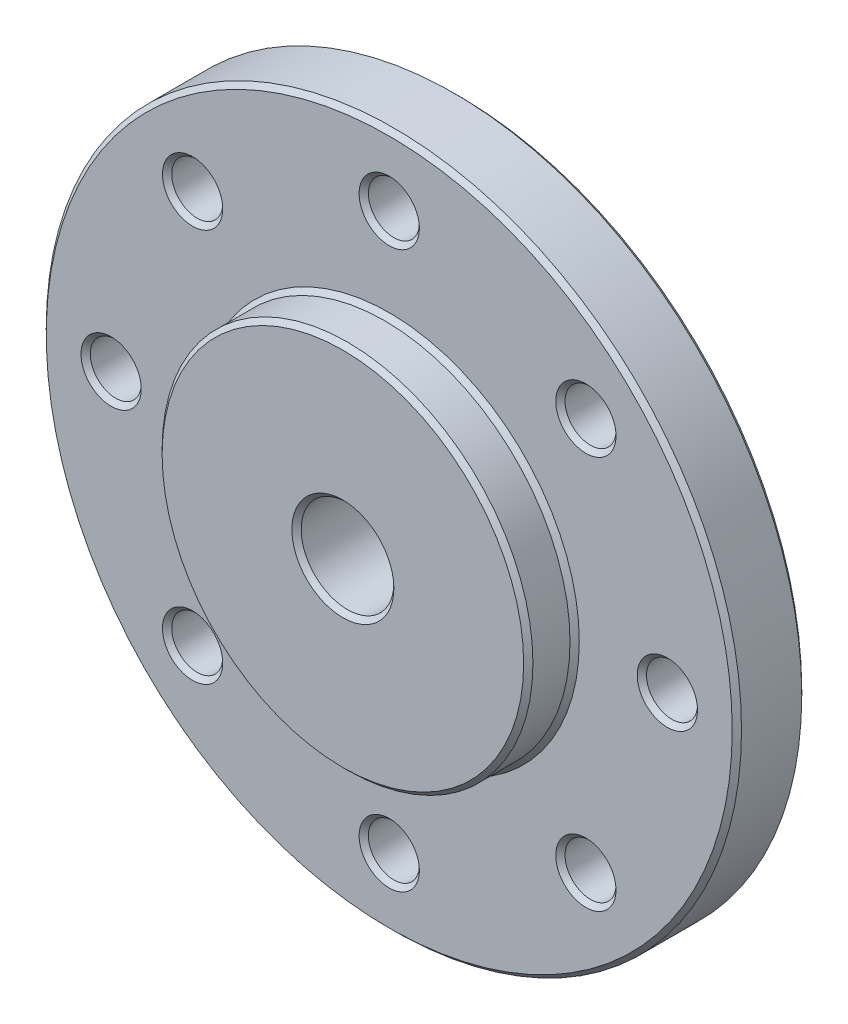
ISO-10303-21;
HEADER;
FILE_DESCRIPTION(('STEP AP214'),'2;1');
FILE_NAME('part.step','',(''),(''),'','','');
FILE_SCHEMA(('AUTOMOTIVE_DESIGN { 1 0 10303 214 1 1 1 1 }'));
ENDSEC;
DATA;
#1=APPLICATION_CONTEXT('core data for automotive mechanical design processes');
#2=APPLICATION_PROTOCOL_DEFINITION('international standard','automotive_design',2000,#1);
#3=PRODUCT_CONTEXT('',#1,'mechanical');
#4=PRODUCT('Part','Part','',(#3));
#5=PRODUCT_RELATED_PRODUCT_CATEGORY('part','',(#4));
#6=PRODUCT_DEFINITION_FORMATION('','',#4);
#7=PRODUCT_DEFINITION_CONTEXT('part definition',#1,'design');
#8=PRODUCT_DEFINITION('design','',#6,#7);
#9=PRODUCT_DEFINITION_SHAPE('','',#8);
#10=(LENGTH_UNIT() NAMED_UNIT(*) SI_UNIT(.MILLI.,.METRE.));
#11=(NAMED_UNIT(*) PLANE_ANGLE_UNIT() SI_UNIT($,.RADIAN.));
#12=(NAMED_UNIT(*) SI_UNIT($,.STERADIAN.) SOLID_ANGLE_UNIT());
#13=UNCERTAINTY_MEASURE_WITH_UNIT(LENGTH_MEASURE(1.E-05),#10,'distance_accuracy_value','');
#14=(GEOMETRIC_REPRESENTATION_CONTEXT(3) GLOBAL_UNCERTAINTY_ASSIGNED_CONTEXT((#13)) GLOBAL_UNIT_ASSIGNED_CONTEXT((#10,
#11,#12)) REPRESENTATION_CONTEXT('',''));
#15=CARTESIAN_POINT('',(0.,0.,0.));
#16=DIRECTION('',(0.,0.,1.));
#17=DIRECTION('',(1.,0.,0.));
#18=AXIS2_PLACEMENT_3D('',#15,#16,#17);
#19=CARTESIAN_POINT('',(0.,0.,15.));
#20=DIRECTION('',(0.,0.,1.));
#21=DIRECTION('',(1.,0.,0.));
#22=AXIS2_PLACEMENT_3D('',#19,#20,#21);
#23=CYLINDRICAL_SURFACE('',#22,40.);
#24=DIRECTION('',(0.,0.,1.));
#25=VECTOR('',#24,1.);
#26=CARTESIAN_POINT('',(40.,0.,15.));
#27=LINE('',#26,#25);
#28=CARTESIAN_POINT('',(40.,0.,16.));
#29=VERTEX_POINT('',#28);
#30=CARTESIAN_POINT('',(40.,0.,24.));
#31=VERTEX_POINT('',#30);
#32=EDGE_CURVE('E9',#29,#31,#27,.T.);
#33=ORIENTED_EDGE('',*,*,#32,.F.);
#34=CARTESIAN_POINT('',(0.,0.,16.));
#35=DIRECTION('',(0.,0.,1.));
#36=DIRECTION('',(1.,0.,0.));
#37=AXIS2_PLACEMENT_3D('',#34,#35,#36);
#38=CIRCLE('',#37,40.);
#39=EDGE_CURVE('E366',#29,#29,#38,.T.);
#40=ORIENTED_EDGE('',*,*,#39,.T.);
#41=ORIENTED_EDGE('',*,*,#32,.T.);
#42=CARTESIAN_POINT('',(0.,0.,24.));
#43=DIRECTION('',(0.,0.,1.));
#44=DIRECTION('',(1.,0.,0.));
#45=AXIS2_PLACEMENT_3D('',#42,#43,#44);
#46=CIRCLE('',#45,40.);
#47=EDGE_CURVE('E442',#31,#31,#46,.T.);
#48=ORIENTED_EDGE('',*,*,#47,.F.);
#49=EDGE_LOOP('',(#33,#40,#41,#48));
#50=FACE_BOUND('',#49,.T.);
#51=ADVANCED_FACE('F15',(#50),#23,.T.);
#52=CARTESIAN_POINT('',(0.,0.,24.));
#53=DIRECTION('',(0.,0.,-1.));
#54=DIRECTION('',(1.,0.,0.));
#55=AXIS2_PLACEMENT_3D('',#52,#53,#54);
#56=CONICAL_SURFACE('',#55,40.,0.785398163397);
#57=ORIENTED_EDGE('',*,*,#47,.T.);
#58=DIRECTION('',(0.707106781186548,0.,-0.707106781186548));
#59=VECTOR('',#58,1.);
#60=CARTESIAN_POINT('',(40.,0.,24.));
#61=LINE('',#60,#59);
#62=CARTESIAN_POINT('',(39.,0.,25.));
#63=VERTEX_POINT('',#62);
#64=EDGE_CURVE('E23',#63,#31,#61,.T.);
#65=ORIENTED_EDGE('',*,*,#64,.F.);
#66=CARTESIAN_POINT('',(0.,0.,25.));
#67=DIRECTION('',(0.,0.,1.));
#68=DIRECTION('',(1.,0.,0.));
#69=AXIS2_PLACEMENT_3D('',#66,#67,#68);
#70=CIRCLE('',#69,39.);
#71=EDGE_CURVE('E367',#63,#63,#70,.T.);
#72=ORIENTED_EDGE('',*,*,#71,.F.);
#73=ORIENTED_EDGE('',*,*,#64,.T.);
#74=EDGE_LOOP('',(#57,#65,#72,#73));
#75=FACE_BOUND('',#74,.T.);
#76=ADVANCED_FACE('F449',(#75),#56,.T.);
#77=CARTESIAN_POINT('',(0.,0.,16.));
#78=DIRECTION('',(0.,0.,-1.));
#79=DIRECTION('',(1.,0.,0.));
#80=AXIS2_PLACEMENT_3D('',#77,#78,#79);
#81=CONICAL_SURFACE('',#80,40.,0.785398163397);
#82=DIRECTION('',(-0.707106781186548,0.,0.707106781186548));
#83=VECTOR('',#82,1.);
#84=CARTESIAN_POINT('',(40.,0.,16.));
#85=LINE('',#84,#83);
#86=CARTESIAN_POINT('',(41.,0.,15.));
#87=VERTEX_POINT('',#86);
#88=EDGE_CURVE('E362',#87,#29,#85,.T.);
#89=ORIENTED_EDGE('',*,*,#88,.F.);
#90=CARTESIAN_POINT('',(0.,0.,15.));
#91=DIRECTION('',(0.,0.,1.));
#92=DIRECTION('',(1.,0.,0.));
#93=AXIS2_PLACEMENT_3D('',#90,#91,#92);
#94=CIRCLE('',#93,41.);
#95=EDGE_CURVE('E433',#87,#87,#94,.T.);
#96=ORIENTED_EDGE('',*,*,#95,.T.);
#97=ORIENTED_EDGE('',*,*,#88,.T.);
#98=ORIENTED_EDGE('',*,*,#39,.F.);
#99=EDGE_LOOP('',(#89,#96,#97,#98));
#100=FACE_BOUND('',#99,.T.);
#101=ADVANCED_FACE('F455',(#100),#81,.T.);
#102=CARTESIAN_POINT('',(0.,0.,25.));
#103=DIRECTION('',(0.,0.,1.));
#104=DIRECTION('',(1.,0.,0.));
#105=AXIS2_PLACEMENT_3D('',#102,#103,#104);
#106=PLANE('',#105);
#107=ORIENTED_EDGE('',*,*,#71,.T.);
#108=EDGE_LOOP('',(#107));
#109=FACE_BOUND('',#108,.T.);
#110=CARTESIAN_POINT('',(0.,0.,25.));
#111=DIRECTION('',(0.,0.,-1.));
#112=DIRECTION('',(1.,0.,0.));
#113=AXIS2_PLACEMENT_3D('',#110,#111,#112);
#114=CIRCLE('',#113,11.);
#115=CARTESIAN_POINT('',(11.,0.,25.));
#116=VERTEX_POINT('',#115);
#117=EDGE_CURVE('E423',#116,#116,#114,.T.);
#118=ORIENTED_EDGE('',*,*,#117,.T.);
#119=EDGE_LOOP('',(#118));
#120=FACE_BOUND('',#119,.T.);
#121=ADVANCED_FACE('F451',(#109,#120),#106,.T.);
#122=CARTESIAN_POINT('',(0.,0.,15.));
#123=DIRECTION('',(0.,0.,1.));
#124=DIRECTION('',(1.,0.,0.));
#125=AXIS2_PLACEMENT_3D('',#122,#123,#124);
#126=PLANE('',#125);
#127=ORIENTED_EDGE('',*,*,#95,.F.);
#128=EDGE_LOOP('',(#127));
#129=FACE_BOUND('',#128,.T.);
#130=CARTESIAN_POINT('',(-42.42640687119,42.426406871193,15.));
#131=DIRECTION('',(0.,0.,-1.));
#132=DIRECTION('',(-0.707106781186548,0.707106781186548,0.));
#133=AXIS2_PLACEMENT_3D('',#130,#131,#132);
#134=CIRCLE('',#133,6.5);
#135=CARTESIAN_POINT('',(-47.0226009489,47.022600948905,15.));
#136=VERTEX_POINT('',#135);
#137=EDGE_CURVE('E418',#136,#136,#134,.T.);
#138=ORIENTED_EDGE('',*,*,#137,.T.);
#139=EDGE_LOOP('',(#138));
#140=FACE_BOUND('',#139,.T.);
#141=CARTESIAN_POINT('',(0.,60.,15.));
#142=DIRECTION('',(0.,0.,-1.));
#143=DIRECTION('',(0.,1.,0.));
#144=AXIS2_PLACEMENT_3D('',#141,#142,#143);
#145=CIRCLE('',#144,6.5);
#146=CARTESIAN_POINT('',(0.,66.5,15.));
#147=VERTEX_POINT('',#146);
#148=EDGE_CURVE('E419',#147,#147,#145,.T.);
#149=ORIENTED_EDGE('',*,*,#148,.T.);
#150=EDGE_LOOP('',(#149));
#151=FACE_BOUND('',#150,.T.);
#152=CARTESIAN_POINT('',(-60.,0.,15.));
#153=DIRECTION('',(0.,0.,-1.));
#154=DIRECTION('',(-1.,0.,0.));
#155=AXIS2_PLACEMENT_3D('',#152,#153,#154);
#156=CIRCLE('',#155,6.5);
#157=CARTESIAN_POINT('',(-66.5,0.,15.));
#158=VERTEX_POINT('',#157);
#159=EDGE_CURVE('E375',#158,#158,#156,.T.);
#160=ORIENTED_EDGE('',*,*,#159,.T.);
#161=EDGE_LOOP('',(#160));
#162=FACE_BOUND('',#161,.T.);
#163=CARTESIAN_POINT('',(42.426406871193,42.426406871193,15.));
#164=DIRECTION('',(0.,0.,-1.));
#165=DIRECTION('',(0.707106781186548,0.707106781186548,0.));
#166=AXIS2_PLACEMENT_3D('',#163,#164,#165);
#167=CIRCLE('',#166,6.5);
#168=CARTESIAN_POINT('',(47.022600948905,47.022600948905,15.));
#169=VERTEX_POINT('',#168);
#170=EDGE_CURVE('E410',#169,#169,#167,.T.);
#171=ORIENTED_EDGE('',*,*,#170,.T.);
#172=EDGE_LOOP('',(#171));
#173=FACE_BOUND('',#172,.T.);
#174=CARTESIAN_POINT('',(60.,0.,15.));
#175=DIRECTION('',(0.,0.,-1.));
#176=DIRECTION('',(1.,0.,0.));
#177=AXIS2_PLACEMENT_3D('',#174,#175,#176);
#178=CIRCLE('',#177,6.5);
#179=CARTESIAN_POINT('',(66.5,0.,15.));
#180=VERTEX_POINT('',#179);
#181=EDGE_CURVE('E403',#180,#180,#178,.T.);
#182=ORIENTED_EDGE('',*,*,#181,.T.);
#183=EDGE_LOOP('',(#182));
#184=FACE_BOUND('',#183,.T.);
#185=CARTESIAN_POINT('',(-42.42640687119,-42.42640687119,15.));
#186=DIRECTION('',(0.,0.,-1.));
#187=DIRECTION('',(-0.707106781186548,-0.707106781186548,0.));
#188=AXIS2_PLACEMENT_3D('',#185,#186,#187);
#189=CIRCLE('',#188,6.5);
#190=CARTESIAN_POINT('',(-47.0226009489,-47.0226009489,15.));
#191=VERTEX_POINT('',#190);
#192=EDGE_CURVE('E399',#191,#191,#189,.T.);
#193=ORIENTED_EDGE('',*,*,#192,.T.);
#194=EDGE_LOOP('',(#193));
#195=FACE_BOUND('',#194,.T.);
#196=CARTESIAN_POINT('',(0.,-60.,15.));
#197=DIRECTION('',(0.,0.,-1.));
#198=DIRECTION('',(0.,-1.,0.));
#199=AXIS2_PLACEMENT_3D('',#196,#197,#198);
#200=CIRCLE('',#199,6.5);
#201=CARTESIAN_POINT('',(0.,-66.5,15.));
#202=VERTEX_POINT('',#201);
#203=EDGE_CURVE('E231',#202,#202,#200,.T.);
#204=ORIENTED_EDGE('',*,*,#203,.T.);
#205=EDGE_LOOP('',(#204));
#206=FACE_BOUND('',#205,.T.);
#207=CARTESIAN_POINT('',(42.426406871193,-42.42640687119,15.));
#208=DIRECTION('',(0.,0.,-1.));
#209=DIRECTION('',(0.707106781186548,-0.707106781186548,0.));
#210=AXIS2_PLACEMENT_3D('',#207,#208,#209);
#211=CIRCLE('',#210,6.5);
#212=CARTESIAN_POINT('',(47.022600948905,-47.0226009489,15.));
#213=VERTEX_POINT('',#212);
#214=EDGE_CURVE('E388',#213,#213,#211,.T.);
#215=ORIENTED_EDGE('',*,*,#214,.T.);
#216=EDGE_LOOP('',(#215));
#217=FACE_BOUND('',#216,.T.);
#218=CARTESIAN_POINT('',(0.,0.,15.));
#219=DIRECTION('',(0.,0.,1.));
#220=DIRECTION('',(1.,0.,0.));
#221=AXIS2_PLACEMENT_3D('',#218,#219,#220);
#222=CIRCLE('',#221,74.);
#223=CARTESIAN_POINT('',(74.,0.,15.));
#224=VERTEX_POINT('',#223);
#225=EDGE_CURVE('E383',#224,#224,#222,.T.);
#226=ORIENTED_EDGE('',*,*,#225,.T.);
#227=EDGE_LOOP('',(#226));
#228=FACE_BOUND('',#227,.T.);
#229=ADVANCED_FACE('F454',(#129,#140,#151,#162,#173,#184,#195,#206,#217,#228),#126,.T.);
#230=CARTESIAN_POINT('',(-42.42640687119,42.426406871193,14.));
#231=DIRECTION('',(0.,0.,1.));
#232=DIRECTION('',(-0.707106781186548,0.707106781186548,0.));
#233=AXIS2_PLACEMENT_3D('',#230,#231,#232);
#234=CONICAL_SURFACE('',#233,5.5,0.785398163397);
#235=DIRECTION('',(-0.49999999999984,0.49999999999984,0.707106781186774));
#236=VECTOR('',#235,1.);
#237=CARTESIAN_POINT('',(-46.31549416771,46.315494167719,14.));
#238=LINE('',#237,#236);
#239=CARTESIAN_POINT('',(-46.31549416771,46.315494167719,14.));
#240=VERTEX_POINT('',#239);
#241=EDGE_CURVE('E414',#240,#136,#238,.T.);
#242=ORIENTED_EDGE('',*,*,#241,.F.);
#243=CARTESIAN_POINT('',(-42.42640687119,42.426406871193,14.));
#244=DIRECTION('',(0.,0.,-1.));
#245=DIRECTION('',(-0.707106781186548,0.707106781186548,0.));
#246=AXIS2_PLACEMENT_3D('',#243,#244,#245);
#247=CIRCLE('',#246,5.5);
#248=EDGE_CURVE('E276',#240,#240,#247,.T.);
#249=ORIENTED_EDGE('',*,*,#248,.T.);
#250=ORIENTED_EDGE('',*,*,#241,.T.);
#251=ORIENTED_EDGE('',*,*,#137,.F.);
#252=EDGE_LOOP('',(#242,#249,#250,#251));
#253=FACE_BOUND('',#252,.T.);
#254=ADVANCED_FACE('F550',(#253),#234,.F.);
#255=CARTESIAN_POINT('',(0.,60.,14.));
#256=DIRECTION('',(0.,0.,1.));
#257=DIRECTION('',(0.,1.,0.));
#258=AXIS2_PLACEMENT_3D('',#255,#256,#257);
#259=CONICAL_SURFACE('',#258,5.5,0.785398163397);
#260=DIRECTION('',(0.,0.707106781186548,0.707106781186548));
#261=VECTOR('',#260,1.);
#262=CARTESIAN_POINT('',(0.,65.5,14.));
#263=LINE('',#262,#261);
#264=CARTESIAN_POINT('',(0.,65.5,14.));
#265=VERTEX_POINT('',#264);
#266=EDGE_CURVE('E378',#265,#147,#263,.T.);
#267=ORIENTED_EDGE('',*,*,#266,.F.);
#268=CARTESIAN_POINT('',(0.,60.,14.));
#269=DIRECTION('',(0.,0.,-1.));
#270=DIRECTION('',(0.,1.,0.));
#271=AXIS2_PLACEMENT_3D('',#268,#269,#270);
#272=CIRCLE('',#271,5.5);
#273=EDGE_CURVE('E258',#265,#265,#272,.T.);
#274=ORIENTED_EDGE('',*,*,#273,.T.);
#275=ORIENTED_EDGE('',*,*,#266,.T.);
#276=ORIENTED_EDGE('',*,*,#148,.F.);
#277=EDGE_LOOP('',(#267,#274,#275,#276));
#278=FACE_BOUND('',#277,.T.);
#279=ADVANCED_FACE('F606',(#278),#259,.F.);
#280=CARTESIAN_POINT('',(-60.,0.,14.));
#281=DIRECTION('',(0.,0.,1.));
#282=DIRECTION('',(-1.,0.,0.));
#283=AXIS2_PLACEMENT_3D('',#280,#281,#282);
#284=CONICAL_SURFACE('',#283,5.5,0.785398163397);
#285=DIRECTION('',(-0.707106781186548,0.,0.707106781186548));
#286=VECTOR('',#285,1.);
#287=CARTESIAN_POINT('',(-65.5,0.,14.));
#288=LINE('',#287,#286);
#289=CARTESIAN_POINT('',(-65.5,0.,14.));
#290=VERTEX_POINT('',#289);
#291=EDGE_CURVE('E379',#290,#158,#288,.T.);
#292=ORIENTED_EDGE('',*,*,#291,.F.);
#293=CARTESIAN_POINT('',(-60.,0.,14.));
#294=DIRECTION('',(0.,0.,-1.));
#295=DIRECTION('',(-1.,0.,0.));
#296=AXIS2_PLACEMENT_3D('',#293,#294,#295);
#297=CIRCLE('',#296,5.5);
#298=EDGE_CURVE('E358',#290,#290,#297,.T.);
#299=ORIENTED_EDGE('',*,*,#298,.T.);
#300=ORIENTED_EDGE('',*,*,#291,.T.);
#301=ORIENTED_EDGE('',*,*,#159,.F.);
#302=EDGE_LOOP('',(#292,#299,#300,#301));
#303=FACE_BOUND('',#302,.T.);
#304=ADVANCED_FACE('F609',(#303),#284,.F.);
#305=CARTESIAN_POINT('',(0.,0.,24.));
#306=DIRECTION('',(0.,0.,1.));
#307=DIRECTION('',(1.,0.,0.));
#308=AXIS2_PLACEMENT_3D('',#305,#306,#307);
#309=CONICAL_SURFACE('',#308,10.,0.785398163397);
#310=DIRECTION('',(0.707106781186548,0.,0.707106781186548));
#311=VECTOR('',#310,1.);
#312=CARTESIAN_POINT('',(10.,0.,24.));
#313=LINE('',#312,#311);
#314=CARTESIAN_POINT('',(10.,0.,24.));
#315=VERTEX_POINT('',#314);
#316=EDGE_CURVE('E413',#315,#116,#313,.T.);
#317=ORIENTED_EDGE('',*,*,#316,.F.);
#318=CARTESIAN_POINT('',(0.,0.,24.));
#319=DIRECTION('',(0.,0.,-1.));
#320=DIRECTION('',(1.,0.,0.));
#321=AXIS2_PLACEMENT_3D('',#318,#319,#320);
#322=CIRCLE('',#321,10.);
#323=EDGE_CURVE('E350',#315,#315,#322,.T.);
#324=ORIENTED_EDGE('',*,*,#323,.T.);
#325=ORIENTED_EDGE('',*,*,#316,.T.);
#326=ORIENTED_EDGE('',*,*,#117,.F.);
#327=EDGE_LOOP('',(#317,#324,#325,#326));
#328=FACE_BOUND('',#327,.T.);
#329=ADVANCED_FACE('F459',(#328),#309,.F.);
#330=CARTESIAN_POINT('',(42.426406871193,42.426406871193,14.));
#331=DIRECTION('',(0.,0.,1.));
#332=DIRECTION('',(0.707106781186548,0.707106781186548,0.));
#333=AXIS2_PLACEMENT_3D('',#330,#331,#332);
#334=CONICAL_SURFACE('',#333,5.5,0.785398163397);
#335=DIRECTION('',(0.49999999999984,0.49999999999984,0.707106781186774));
#336=VECTOR('',#335,1.);
#337=CARTESIAN_POINT('',(46.315494167719,46.315494167719,14.));
#338=LINE('',#337,#336);
#339=CARTESIAN_POINT('',(46.315494167719,46.315494167719,14.));
#340=VERTEX_POINT('',#339);
#341=EDGE_CURVE('E406',#340,#169,#338,.T.);
#342=ORIENTED_EDGE('',*,*,#341,.F.);
#343=CARTESIAN_POINT('',(42.426406871193,42.426406871193,14.));
#344=DIRECTION('',(0.,0.,-1.));
#345=DIRECTION('',(0.707106781186548,0.707106781186548,0.));
#346=AXIS2_PLACEMENT_3D('',#343,#344,#345);
#347=CIRCLE('',#346,5.5);
#348=EDGE_CURVE('E285',#340,#340,#347,.T.);
#349=ORIENTED_EDGE('',*,*,#348,.T.);
#350=ORIENTED_EDGE('',*,*,#341,.T.);
#351=ORIENTED_EDGE('',*,*,#170,.F.);
#352=EDGE_LOOP('',(#342,#349,#350,#351));
#353=FACE_BOUND('',#352,.T.);
#354=ADVANCED_FACE('F614',(#353),#334,.F.);
#355=CARTESIAN_POINT('',(60.,0.,14.));
#356=DIRECTION('',(0.,0.,1.));
#357=DIRECTION('',(1.,0.,0.));
#358=AXIS2_PLACEMENT_3D('',#355,#356,#357);
#359=CONICAL_SURFACE('',#358,5.5,0.785398163397);
#360=DIRECTION('',(0.707106781186548,0.,0.707106781186548));
#361=VECTOR('',#360,1.);
#362=CARTESIAN_POINT('',(65.5,0.,14.));
#363=LINE('',#362,#361);
#364=CARTESIAN_POINT('',(65.5,0.,14.));
#365=VERTEX_POINT('',#364);
#366=EDGE_CURVE('E402',#365,#180,#363,.T.);
#367=ORIENTED_EDGE('',*,*,#366,.F.);
#368=CARTESIAN_POINT('',(60.,0.,14.));
#369=DIRECTION('',(0.,0.,-1.));
#370=DIRECTION('',(1.,0.,0.));
#371=AXIS2_PLACEMENT_3D('',#368,#369,#370);
#372=CIRCLE('',#371,5.5);
#373=EDGE_CURVE('E286',#365,#365,#372,.T.);
#374=ORIENTED_EDGE('',*,*,#373,.T.);
#375=ORIENTED_EDGE('',*,*,#366,.T.);
#376=ORIENTED_EDGE('',*,*,#181,.F.);
#377=EDGE_LOOP('',(#367,#374,#375,#376));
#378=FACE_BOUND('',#377,.T.);
#379=ADVANCED_FACE('F617',(#378),#359,.F.);
#380=CARTESIAN_POINT('',(-42.42640687119,-42.42640687119,14.));
#381=DIRECTION('',(0.,0.,1.));
#382=DIRECTION('',(-0.707106781186548,-0.707106781186548,0.));
#383=AXIS2_PLACEMENT_3D('',#380,#381,#382);
#384=CONICAL_SURFACE('',#383,5.5,0.785398163397);
#385=DIRECTION('',(-0.49999999999984,-0.49999999999984,0.707106781186774));
#386=VECTOR('',#385,1.);
#387=CARTESIAN_POINT('',(-46.31549416771,-46.31549416771,14.));
#388=LINE('',#387,#386);
#389=CARTESIAN_POINT('',(-46.31549416771,-46.31549416771,14.));
#390=VERTEX_POINT('',#389);
#391=EDGE_CURVE('E395',#390,#191,#388,.T.);
#392=ORIENTED_EDGE('',*,*,#391,.F.);
#393=CARTESIAN_POINT('',(-42.42640687119,-42.42640687119,14.));
#394=DIRECTION('',(0.,0.,-1.));
#395=DIRECTION('',(-0.707106781186548,-0.707106781186548,0.));
#396=AXIS2_PLACEMENT_3D('',#393,#394,#395);
#397=CIRCLE('',#396,5.5);
#398=EDGE_CURVE('E336',#390,#390,#397,.T.);
#399=ORIENTED_EDGE('',*,*,#398,.T.);
#400=ORIENTED_EDGE('',*,*,#391,.T.);
#401=ORIENTED_EDGE('',*,*,#192,.F.);
#402=EDGE_LOOP('',(#392,#399,#400,#401));
#403=FACE_BOUND('',#402,.T.);
#404=ADVANCED_FACE('F621',(#403),#384,.F.);
#405=CARTESIAN_POINT('',(0.,-60.,14.));
#406=DIRECTION('',(0.,0.,1.));
#407=DIRECTION('',(0.,-1.,0.));
#408=AXIS2_PLACEMENT_3D('',#405,#406,#407);
#409=CONICAL_SURFACE('',#408,5.5,0.785398163397);
#410=DIRECTION('',(0.,-0.707106781186548,0.707106781186548));
#411=VECTOR('',#410,1.);
#412=CARTESIAN_POINT('',(0.,-65.5,14.));
#413=LINE('',#412,#411);
#414=CARTESIAN_POINT('',(0.,-65.5,14.));
#415=VERTEX_POINT('',#414);
#416=EDGE_CURVE('E391',#415,#202,#413,.T.);
#417=ORIENTED_EDGE('',*,*,#416,.F.);
#418=CARTESIAN_POINT('',(0.,-60.,14.));
#419=DIRECTION('',(0.,0.,-1.));
#420=DIRECTION('',(0.,-1.,0.));
#421=AXIS2_PLACEMENT_3D('',#418,#419,#420);
#422=CIRCLE('',#421,5.5);
#423=EDGE_CURVE('E233',#415,#415,#422,.T.);
#424=ORIENTED_EDGE('',*,*,#423,.T.);
#425=ORIENTED_EDGE('',*,*,#416,.T.);
#426=ORIENTED_EDGE('',*,*,#203,.F.);
#427=EDGE_LOOP('',(#417,#424,#425,#426));
#428=FACE_BOUND('',#427,.T.);
#429=ADVANCED_FACE('F625',(#428),#409,.F.);
#430=CARTESIAN_POINT('',(42.426406871193,-42.42640687119,14.));
#431=DIRECTION('',(0.,0.,1.));
#432=DIRECTION('',(0.707106781186548,-0.707106781186548,0.));
#433=AXIS2_PLACEMENT_3D('',#430,#431,#432);
#434=CONICAL_SURFACE('',#433,5.5,0.785398163397);
#435=DIRECTION('',(0.49999999999984,-0.49999999999984,0.707106781186774));
#436=VECTOR('',#435,1.);
#437=CARTESIAN_POINT('',(46.315494167719,-46.31549416771,14.));
#438=LINE('',#437,#436);
#439=CARTESIAN_POINT('',(46.315494167719,-46.31549416771,14.));
#440=VERTEX_POINT('',#439);
#441=EDGE_CURVE('E384',#440,#213,#438,.T.);
#442=ORIENTED_EDGE('',*,*,#441,.F.);
#443=CARTESIAN_POINT('',(42.426406871193,-42.42640687119,14.));
#444=DIRECTION('',(0.,0.,-1.));
#445=DIRECTION('',(0.707106781186548,-0.707106781186548,0.));
#446=AXIS2_PLACEMENT_3D('',#443,#444,#445);
#447=CIRCLE('',#446,5.5);
#448=EDGE_CURVE('E326',#440,#440,#447,.T.);
#449=ORIENTED_EDGE('',*,*,#448,.T.);
#450=ORIENTED_EDGE('',*,*,#441,.T.);
#451=ORIENTED_EDGE('',*,*,#214,.F.);
#452=EDGE_LOOP('',(#442,#449,#450,#451));
#453=FACE_BOUND('',#452,.T.);
#454=ADVANCED_FACE('F627',(#453),#434,.F.);
#455=CARTESIAN_POINT('',(0.,0.,14.));
#456=DIRECTION('',(0.,0.,-1.));
#457=DIRECTION('',(1.,0.,0.));
#458=AXIS2_PLACEMENT_3D('',#455,#456,#457);
#459=CONICAL_SURFACE('',#458,75.,0.785398163397);
#460=DIRECTION('',(-0.707106781186548,0.,0.707106781186548));
#461=VECTOR('',#460,1.);
#462=CARTESIAN_POINT('',(75.,0.,14.));
#463=LINE('',#462,#461);
#464=CARTESIAN_POINT('',(75.,0.,14.));
#465=VERTEX_POINT('',#464);
#466=EDGE_CURVE('E374',#465,#224,#463,.T.);
#467=ORIENTED_EDGE('',*,*,#466,.F.);
#468=CARTESIAN_POINT('',(0.,0.,14.));
#469=DIRECTION('',(0.,0.,1.));
#470=DIRECTION('',(1.,0.,0.));
#471=AXIS2_PLACEMENT_3D('',#468,#469,#470);
#472=CIRCLE('',#471,75.);
#473=EDGE_CURVE('E318',#465,#465,#472,.T.);
#474=ORIENTED_EDGE('',*,*,#473,.T.);
#475=ORIENTED_EDGE('',*,*,#466,.T.);
#476=ORIENTED_EDGE('',*,*,#225,.F.);
#477=EDGE_LOOP('',(#467,#474,#475,#476));
#478=FACE_BOUND('',#477,.T.);
#479=ADVANCED_FACE('F577',(#478),#459,.T.);
#480=CARTESIAN_POINT('',(-42.42640687119,42.426406871193,0.));
#481=DIRECTION('',(0.,0.,-1.));
#482=DIRECTION('',(-0.707106781186548,0.707106781186548,0.));
#483=AXIS2_PLACEMENT_3D('',#480,#481,#482);
#484=CYLINDRICAL_SURFACE('',#483,5.5);
#485=DIRECTION('',(0.,0.,1.));
#486=VECTOR('',#485,1.);
#487=CARTESIAN_POINT('',(-46.31549416771,46.315494167719,0.));
#488=LINE('',#487,#486);
#489=CARTESIAN_POINT('',(-46.31549416771,46.315494167719,1.));
#490=VERTEX_POINT('',#489);
#491=EDGE_CURVE('E262',#490,#240,#488,.T.);
#492=ORIENTED_EDGE('',*,*,#491,.F.);
#493=CARTESIAN_POINT('',(-42.42640687119,42.426406871193,1.));
#494=DIRECTION('',(0.,0.,1.));
#495=DIRECTION('',(-0.707106781186548,0.707106781186548,0.));
#496=AXIS2_PLACEMENT_3D('',#493,#494,#495);
#497=CIRCLE('',#496,5.5);
#498=EDGE_CURVE('E252',#490,#490,#497,.T.);
#499=ORIENTED_EDGE('',*,*,#498,.F.);
#500=ORIENTED_EDGE('',*,*,#491,.T.);
#501=ORIENTED_EDGE('',*,*,#248,.F.);
#502=EDGE_LOOP('',(#492,#499,#500,#501));
#503=FACE_BOUND('',#502,.T.);
#504=ADVANCED_FACE('F547',(#503),#484,.F.);
#505=CARTESIAN_POINT('',(0.,60.,0.));
#506=DIRECTION('',(0.,0.,-1.));
#507=DIRECTION('',(0.,1.,0.));
#508=AXIS2_PLACEMENT_3D('',#505,#506,#507);
#509=CYLINDRICAL_SURFACE('',#508,5.5);
#510=DIRECTION('',(0.,0.,1.));
#511=VECTOR('',#510,1.);
#512=CARTESIAN_POINT('',(0.,65.5,0.));
#513=LINE('',#512,#511);
#514=CARTESIAN_POINT('',(0.,65.5,1.));
#515=VERTEX_POINT('',#514);
#516=EDGE_CURVE('E263',#515,#265,#513,.T.);
#517=ORIENTED_EDGE('',*,*,#516,.F.);
#518=CARTESIAN_POINT('',(0.,60.,1.));
#519=DIRECTION('',(0.,0.,1.));
#520=DIRECTION('',(0.,1.,0.));
#521=AXIS2_PLACEMENT_3D('',#518,#519,#520);
#522=CIRCLE('',#521,5.5);
#523=EDGE_CURVE('E291',#515,#515,#522,.T.);
#524=ORIENTED_EDGE('',*,*,#523,.F.);
#525=ORIENTED_EDGE('',*,*,#516,.T.);
#526=ORIENTED_EDGE('',*,*,#273,.F.);
#527=EDGE_LOOP('',(#517,#524,#525,#526));
#528=FACE_BOUND('',#527,.T.);
#529=ADVANCED_FACE('F635',(#528),#509,.F.);
#530=CARTESIAN_POINT('',(-60.,0.,0.));
#531=DIRECTION('',(0.,0.,-1.));
#532=DIRECTION('',(-1.,0.,0.));
#533=AXIS2_PLACEMENT_3D('',#530,#531,#532);
#534=CYLINDRICAL_SURFACE('',#533,5.5);
#535=DIRECTION('',(0.,0.,1.));
#536=VECTOR('',#535,1.);
#537=CARTESIAN_POINT('',(-65.5,0.,0.));
#538=LINE('',#537,#536);
#539=CARTESIAN_POINT('',(-65.5,0.,1.));
#540=VERTEX_POINT('',#539);
#541=EDGE_CURVE('E354',#540,#290,#538,.T.);
#542=ORIENTED_EDGE('',*,*,#541,.F.);
#543=CARTESIAN_POINT('',(-60.,0.,1.));
#544=DIRECTION('',(0.,0.,1.));
#545=DIRECTION('',(-1.,0.,0.));
#546=AXIS2_PLACEMENT_3D('',#543,#544,#545);
#547=CIRCLE('',#546,5.5);
#548=EDGE_CURVE('E303',#540,#540,#547,.T.);
#549=ORIENTED_EDGE('',*,*,#548,.F.);
#550=ORIENTED_EDGE('',*,*,#541,.T.);
#551=ORIENTED_EDGE('',*,*,#298,.F.);
#552=EDGE_LOOP('',(#542,#549,#550,#551));
#553=FACE_BOUND('',#552,.T.);
#554=ADVANCED_FACE('F636',(#553),#534,.F.);
#555=CARTESIAN_POINT('',(0.,0.,0.));
#556=DIRECTION('',(0.,0.,-1.));
#557=DIRECTION('',(1.,0.,0.));
#558=AXIS2_PLACEMENT_3D('',#555,#556,#557);
#559=CYLINDRICAL_SURFACE('',#558,10.);
#560=DIRECTION('',(0.,0.,1.));
#561=VECTOR('',#560,1.);
#562=CARTESIAN_POINT('',(10.,0.,0.));
#563=LINE('',#562,#561);
#564=CARTESIAN_POINT('',(10.,0.,1.));
#565=VERTEX_POINT('',#564);
#566=EDGE_CURVE('E346',#565,#315,#563,.T.);
#567=ORIENTED_EDGE('',*,*,#566,.F.);
#568=CARTESIAN_POINT('',(0.,0.,1.));
#569=DIRECTION('',(0.,0.,1.));
#570=DIRECTION('',(1.,0.,0.));
#571=AXIS2_PLACEMENT_3D('',#568,#569,#570);
#572=CIRCLE('',#571,10.);
#573=EDGE_CURVE('E295',#565,#565,#572,.T.);
#574=ORIENTED_EDGE('',*,*,#573,.F.);
#575=ORIENTED_EDGE('',*,*,#566,.T.);
#576=ORIENTED_EDGE('',*,*,#323,.F.);
#577=EDGE_LOOP('',(#567,#574,#575,#576));
#578=FACE_BOUND('',#577,.T.);
#579=ADVANCED_FACE('F462',(#578),#559,.F.);
#580=CARTESIAN_POINT('',(42.426406871193,42.426406871193,0.));
#581=DIRECTION('',(0.,0.,-1.));
#582=DIRECTION('',(0.707106781186548,0.707106781186548,0.));
#583=AXIS2_PLACEMENT_3D('',#580,#581,#582);
#584=CYLINDRICAL_SURFACE('',#583,5.5);
#585=DIRECTION('',(0.,0.,1.));
#586=VECTOR('',#585,1.);
#587=CARTESIAN_POINT('',(46.315494167719,46.315494167719,0.));
#588=LINE('',#587,#586);
#589=CARTESIAN_POINT('',(46.315494167719,46.315494167719,1.));
#590=VERTEX_POINT('',#589);
#591=EDGE_CURVE('E281',#590,#340,#588,.T.);
#592=ORIENTED_EDGE('',*,*,#591,.F.);
#593=CARTESIAN_POINT('',(42.426406871193,42.426406871193,1.));
#594=DIRECTION('',(0.,0.,1.));
#595=DIRECTION('',(0.707106781186548,0.707106781186548,0.));
#596=AXIS2_PLACEMENT_3D('',#593,#594,#595);
#597=CIRCLE('',#596,5.5);
#598=EDGE_CURVE('E272',#590,#590,#597,.T.);
#599=ORIENTED_EDGE('',*,*,#598,.F.);
#600=ORIENTED_EDGE('',*,*,#591,.T.);
#601=ORIENTED_EDGE('',*,*,#348,.F.);
#602=EDGE_LOOP('',(#592,#599,#600,#601));
#603=FACE_BOUND('',#602,.T.);
#604=ADVANCED_FACE('F642',(#603),#584,.F.);
#605=CARTESIAN_POINT('',(60.,0.,0.));
#606=DIRECTION('',(0.,0.,-1.));
#607=DIRECTION('',(1.,0.,0.));
#608=AXIS2_PLACEMENT_3D('',#605,#606,#607);
#609=CYLINDRICAL_SURFACE('',#608,5.5);
#610=DIRECTION('',(0.,0.,1.));
#611=VECTOR('',#610,1.);
#612=CARTESIAN_POINT('',(65.5,0.,0.));
#613=LINE('',#612,#611);
#614=CARTESIAN_POINT('',(65.5,0.,1.));
#615=VERTEX_POINT('',#614);
#616=EDGE_CURVE('E314',#615,#365,#613,.T.);
#617=ORIENTED_EDGE('',*,*,#616,.F.);
#618=CARTESIAN_POINT('',(60.,0.,1.));
#619=DIRECTION('',(0.,0.,1.));
#620=DIRECTION('',(1.,0.,0.));
#621=AXIS2_PLACEMENT_3D('',#618,#619,#620);
#622=CIRCLE('',#621,5.5);
#623=EDGE_CURVE('E264',#615,#615,#622,.T.);
#624=ORIENTED_EDGE('',*,*,#623,.F.);
#625=ORIENTED_EDGE('',*,*,#616,.T.);
#626=ORIENTED_EDGE('',*,*,#373,.F.);
#627=EDGE_LOOP('',(#617,#624,#625,#626));
#628=FACE_BOUND('',#627,.T.);
#629=ADVANCED_FACE('F645',(#628),#609,.F.);
#630=CARTESIAN_POINT('',(-42.42640687119,-42.42640687119,0.));
#631=DIRECTION('',(0.,0.,-1.));
#632=DIRECTION('',(-0.707106781186548,-0.707106781186548,0.));
#633=AXIS2_PLACEMENT_3D('',#630,#631,#632);
#634=CYLINDRICAL_SURFACE('',#633,5.5);
#635=DIRECTION('',(0.,0.,1.));
#636=VECTOR('',#635,1.);
#637=CARTESIAN_POINT('',(-46.31549416771,-46.31549416771,0.));
#638=LINE('',#637,#636);
#639=CARTESIAN_POINT('',(-46.31549416771,-46.31549416771,1.));
#640=VERTEX_POINT('',#639);
#641=EDGE_CURVE('E236',#640,#390,#638,.T.);
#642=ORIENTED_EDGE('',*,*,#641,.F.);
#643=CARTESIAN_POINT('',(-42.42640687119,-42.42640687119,1.));
#644=DIRECTION('',(0.,0.,1.));
#645=DIRECTION('',(-0.707106781186548,-0.707106781186548,0.));
#646=AXIS2_PLACEMENT_3D('',#643,#644,#645);
#647=CIRCLE('',#646,5.5);
#648=EDGE_CURVE('E253',#640,#640,#647,.T.);
#649=ORIENTED_EDGE('',*,*,#648,.F.);
#650=ORIENTED_EDGE('',*,*,#641,.T.);
#651=ORIENTED_EDGE('',*,*,#398,.F.);
#652=EDGE_LOOP('',(#642,#649,#650,#651));
#653=FACE_BOUND('',#652,.T.);
#654=ADVANCED_FACE('F647',(#653),#634,.F.);
#655=CARTESIAN_POINT('',(0.,-60.,0.));
#656=DIRECTION('',(0.,0.,-1.));
#657=DIRECTION('',(0.,-1.,0.));
#658=AXIS2_PLACEMENT_3D('',#655,#656,#657);
#659=CYLINDRICAL_SURFACE('',#658,5.5);
#660=DIRECTION('',(0.,0.,1.));
#661=VECTOR('',#660,1.);
#662=CARTESIAN_POINT('',(0.,-65.5,0.));
#663=LINE('',#662,#661);
#664=CARTESIAN_POINT('',(0.,-65.5,1.));
#665=VERTEX_POINT('',#664);
#666=EDGE_CURVE('E237',#665,#415,#663,.T.);
#667=ORIENTED_EDGE('',*,*,#666,.F.);
#668=CARTESIAN_POINT('',(0.,-60.,1.));
#669=DIRECTION('',(0.,0.,1.));
#670=DIRECTION('',(0.,-1.,0.));
#671=AXIS2_PLACEMENT_3D('',#668,#669,#670);
#672=CIRCLE('',#671,5.5);
#673=EDGE_CURVE('E242',#665,#665,#672,.T.);
#674=ORIENTED_EDGE('',*,*,#673,.F.);
#675=ORIENTED_EDGE('',*,*,#666,.T.);
#676=ORIENTED_EDGE('',*,*,#423,.F.);
#677=EDGE_LOOP('',(#667,#674,#675,#676));
#678=FACE_BOUND('',#677,.T.);
#679=ADVANCED_FACE('F591',(#678),#659,.F.);
#680=CARTESIAN_POINT('',(42.426406871193,-42.42640687119,0.));
#681=DIRECTION('',(0.,0.,-1.));
#682=DIRECTION('',(0.707106781186548,-0.707106781186548,0.));
#683=AXIS2_PLACEMENT_3D('',#680,#681,#682);
#684=CYLINDRICAL_SURFACE('',#683,5.5);
#685=DIRECTION('',(0.,0.,1.));
#686=VECTOR('',#685,1.);
#687=CARTESIAN_POINT('',(46.315494167719,-46.31549416771,0.));
#688=LINE('',#687,#686);
#689=CARTESIAN_POINT('',(46.315494167719,-46.31549416771,1.));
#690=VERTEX_POINT('',#689);
#691=EDGE_CURVE('E322',#690,#440,#688,.T.);
#692=ORIENTED_EDGE('',*,*,#691,.F.);
#693=CARTESIAN_POINT('',(42.426406871193,-42.42640687119,1.));
#694=DIRECTION('',(0.,0.,1.));
#695=DIRECTION('',(0.707106781186548,-0.707106781186548,0.));
#696=AXIS2_PLACEMENT_3D('',#693,#694,#695);
#697=CIRCLE('',#696,5.5);
#698=EDGE_CURVE('E223',#690,#690,#697,.T.);
#699=ORIENTED_EDGE('',*,*,#698,.F.);
#700=ORIENTED_EDGE('',*,*,#691,.T.);
#701=ORIENTED_EDGE('',*,*,#448,.F.);
#702=EDGE_LOOP('',(#692,#699,#700,#701));
#703=FACE_BOUND('',#702,.T.);
#704=ADVANCED_FACE('F582',(#703),#684,.F.);
#705=CARTESIAN_POINT('',(0.,0.,0.));
#706=DIRECTION('',(0.,0.,1.));
#707=DIRECTION('',(1.,0.,0.));
#708=AXIS2_PLACEMENT_3D('',#705,#706,#707);
#709=CYLINDRICAL_SURFACE('',#708,75.);
#710=DIRECTION('',(0.,0.,1.));
#711=VECTOR('',#710,1.);
#712=CARTESIAN_POINT('',(75.,0.,0.));
#713=LINE('',#712,#711);
#714=CARTESIAN_POINT('',(75.,0.,1.));
#715=VERTEX_POINT('',#714);
#716=EDGE_CURVE('E251',#715,#465,#713,.T.);
#717=ORIENTED_EDGE('',*,*,#716,.F.);
#718=CARTESIAN_POINT('',(0.,0.,1.));
#719=DIRECTION('',(0.,0.,1.));
#720=DIRECTION('',(1.,0.,0.));
#721=AXIS2_PLACEMENT_3D('',#718,#719,#720);
#722=CIRCLE('',#721,75.);
#723=EDGE_CURVE('E215',#715,#715,#722,.T.);
#724=ORIENTED_EDGE('',*,*,#723,.T.);
#725=ORIENTED_EDGE('',*,*,#716,.T.);
#726=ORIENTED_EDGE('',*,*,#473,.F.);
#727=EDGE_LOOP('',(#717,#724,#725,#726));
#728=FACE_BOUND('',#727,.T.);
#729=ADVANCED_FACE('F580',(#728),#709,.T.);
#730=CARTESIAN_POINT('',(-42.42640687119,42.426406871193,1.));
#731=DIRECTION('',(0.,0.,-1.));
#732=DIRECTION('',(-0.707106781186548,0.707106781186548,0.));
#733=AXIS2_PLACEMENT_3D('',#730,#731,#732);
#734=CONICAL_SURFACE('',#733,5.5,0.785398163397);
#735=ORIENTED_EDGE('',*,*,#498,.T.);
#736=DIRECTION('',(0.49999999999984,-0.49999999999984,0.707106781186774));
#737=VECTOR('',#736,1.);
#738=CARTESIAN_POINT('',(-46.31549416771,46.315494167719,1.));
#739=LINE('',#738,#737);
#740=CARTESIAN_POINT('',(-47.0226009489,47.022600948905,0.));
#741=VERTEX_POINT('',#740);
#742=EDGE_CURVE('E247',#741,#490,#739,.T.);
#743=ORIENTED_EDGE('',*,*,#742,.F.);
#744=CARTESIAN_POINT('',(-42.42640687119,42.426406871193,0.));
#745=DIRECTION('',(0.,0.,1.));
#746=DIRECTION('',(-0.707106781186548,0.707106781186548,0.));
#747=AXIS2_PLACEMENT_3D('',#744,#745,#746);
#748=CIRCLE('',#747,6.5);
#749=EDGE_CURVE('E217',#741,#741,#748,.T.);
#750=ORIENTED_EDGE('',*,*,#749,.F.);
#751=ORIENTED_EDGE('',*,*,#742,.T.);
#752=EDGE_LOOP('',(#735,#743,#750,#751));
#753=FACE_BOUND('',#752,.T.);
#754=ADVANCED_FACE('F544',(#753),#734,.F.);
#755=CARTESIAN_POINT('',(0.,60.,1.));
#756=DIRECTION('',(0.,0.,-1.));
#757=DIRECTION('',(0.,1.,0.));
#758=AXIS2_PLACEMENT_3D('',#755,#756,#757);
#759=CONICAL_SURFACE('',#758,5.5,0.785398163397);
#760=ORIENTED_EDGE('',*,*,#523,.T.);
#761=DIRECTION('',(0.,-0.707106781186548,0.707106781186548));
#762=VECTOR('',#761,1.);
#763=CARTESIAN_POINT('',(0.,65.5,1.));
#764=LINE('',#763,#762);
#765=CARTESIAN_POINT('',(0.,66.5,0.));
#766=VERTEX_POINT('',#765);
#767=EDGE_CURVE('E287',#766,#515,#764,.T.);
#768=ORIENTED_EDGE('',*,*,#767,.F.);
#769=CARTESIAN_POINT('',(0.,60.,0.));
#770=DIRECTION('',(0.,0.,1.));
#771=DIRECTION('',(0.,1.,0.));
#772=AXIS2_PLACEMENT_3D('',#769,#770,#771);
#773=CIRCLE('',#772,6.5);
#774=EDGE_CURVE('E227',#766,#766,#773,.T.);
#775=ORIENTED_EDGE('',*,*,#774,.F.);
#776=ORIENTED_EDGE('',*,*,#767,.T.);
#777=EDGE_LOOP('',(#760,#768,#775,#776));
#778=FACE_BOUND('',#777,.T.);
#779=ADVANCED_FACE('F589',(#778),#759,.F.);
#780=CARTESIAN_POINT('',(-60.,0.,1.));
#781=DIRECTION('',(0.,0.,-1.));
#782=DIRECTION('',(-1.,0.,0.));
#783=AXIS2_PLACEMENT_3D('',#780,#781,#782);
#784=CONICAL_SURFACE('',#783,5.5,0.785398163397);
#785=ORIENTED_EDGE('',*,*,#548,.T.);
#786=DIRECTION('',(0.707106781186548,0.,0.707106781186548));
#787=VECTOR('',#786,1.);
#788=CARTESIAN_POINT('',(-65.5,0.,1.));
#789=LINE('',#788,#787);
#790=CARTESIAN_POINT('',(-66.5,0.,0.));
#791=VERTEX_POINT('',#790);
#792=EDGE_CURVE('E307',#791,#540,#789,.T.);
#793=ORIENTED_EDGE('',*,*,#792,.F.);
#794=CARTESIAN_POINT('',(-60.,0.,0.));
#795=DIRECTION('',(0.,0.,1.));
#796=DIRECTION('',(-1.,0.,0.));
#797=AXIS2_PLACEMENT_3D('',#794,#795,#796);
#798=CIRCLE('',#797,6.5);
#799=EDGE_CURVE('E471',#791,#791,#798,.T.);
#800=ORIENTED_EDGE('',*,*,#799,.F.);
#801=ORIENTED_EDGE('',*,*,#792,.T.);
#802=EDGE_LOOP('',(#785,#793,#800,#801));
#803=FACE_BOUND('',#802,.T.);
#804=ADVANCED_FACE('F657',(#803),#784,.F.);
#805=CARTESIAN_POINT('',(0.,0.,1.));
#806=DIRECTION('',(0.,0.,-1.));
#807=DIRECTION('',(1.,0.,0.));
#808=AXIS2_PLACEMENT_3D('',#805,#806,#807);
#809=CONICAL_SURFACE('',#808,10.,0.785398163397);
#810=ORIENTED_EDGE('',*,*,#573,.T.);
#811=DIRECTION('',(-0.707106781186548,0.,0.707106781186548));
#812=VECTOR('',#811,1.);
#813=CARTESIAN_POINT('',(10.,0.,1.));
#814=LINE('',#813,#812);
#815=CARTESIAN_POINT('',(11.,0.,0.));
#816=VERTEX_POINT('',#815);
#817=EDGE_CURVE('E299',#816,#565,#814,.T.);
#818=ORIENTED_EDGE('',*,*,#817,.F.);
#819=CARTESIAN_POINT('',(0.,0.,0.));
#820=DIRECTION('',(0.,0.,1.));
#821=DIRECTION('',(1.,0.,0.));
#822=AXIS2_PLACEMENT_3D('',#819,#820,#821);
#823=CIRCLE('',#822,11.);
#824=EDGE_CURVE('E468',#816,#816,#823,.T.);
#825=ORIENTED_EDGE('',*,*,#824,.F.);
#826=ORIENTED_EDGE('',*,*,#817,.T.);
#827=EDGE_LOOP('',(#810,#818,#825,#826));
#828=FACE_BOUND('',#827,.T.);
#829=ADVANCED_FACE('F465',(#828),#809,.F.);
#830=CARTESIAN_POINT('',(42.426406871193,42.426406871193,1.));
#831=DIRECTION('',(0.,0.,-1.));
#832=DIRECTION('',(0.707106781186548,0.707106781186548,0.));
#833=AXIS2_PLACEMENT_3D('',#830,#831,#832);
#834=CONICAL_SURFACE('',#833,5.5,0.785398163397);
#835=ORIENTED_EDGE('',*,*,#598,.T.);
#836=DIRECTION('',(-0.49999999999984,-0.49999999999984,0.707106781186774));
#837=VECTOR('',#836,1.);
#838=CARTESIAN_POINT('',(46.315494167719,46.315494167719,1.));
#839=LINE('',#838,#837);
#840=CARTESIAN_POINT('',(47.022600948905,47.022600948905,0.));
#841=VERTEX_POINT('',#840);
#842=EDGE_CURVE('E280',#841,#590,#839,.T.);
#843=ORIENTED_EDGE('',*,*,#842,.F.);
#844=CARTESIAN_POINT('',(42.426406871193,42.426406871193,0.));
#845=DIRECTION('',(0.,0.,1.));
#846=DIRECTION('',(0.707106781186548,0.707106781186548,0.));
#847=AXIS2_PLACEMENT_3D('',#844,#845,#846);
#848=CIRCLE('',#847,6.5);
#849=EDGE_CURVE('E472',#841,#841,#848,.T.);
#850=ORIENTED_EDGE('',*,*,#849,.F.);
#851=ORIENTED_EDGE('',*,*,#842,.T.);
#852=EDGE_LOOP('',(#835,#843,#850,#851));
#853=FACE_BOUND('',#852,.T.);
#854=ADVANCED_FACE('F656',(#853),#834,.F.);
#855=CARTESIAN_POINT('',(60.,0.,1.));
#856=DIRECTION('',(0.,0.,-1.));
#857=DIRECTION('',(1.,0.,0.));
#858=AXIS2_PLACEMENT_3D('',#855,#856,#857);
#859=CONICAL_SURFACE('',#858,5.5,0.785398163397);
#860=ORIENTED_EDGE('',*,*,#623,.T.);
#861=DIRECTION('',(-0.707106781186548,0.,0.707106781186548));
#862=VECTOR('',#861,1.);
#863=CARTESIAN_POINT('',(65.5,0.,1.));
#864=LINE('',#863,#862);
#865=CARTESIAN_POINT('',(66.5,0.,0.));
#866=VERTEX_POINT('',#865);
#867=EDGE_CURVE('E268',#866,#615,#864,.T.);
#868=ORIENTED_EDGE('',*,*,#867,.F.);
#869=CARTESIAN_POINT('',(60.,0.,0.));
#870=DIRECTION('',(0.,0.,1.));
#871=DIRECTION('',(1.,0.,0.));
#872=AXIS2_PLACEMENT_3D('',#869,#870,#871);
#873=CIRCLE('',#872,6.5);
#874=EDGE_CURVE('E480',#866,#866,#873,.T.);
#875=ORIENTED_EDGE('',*,*,#874,.F.);
#876=ORIENTED_EDGE('',*,*,#867,.T.);
#877=EDGE_LOOP('',(#860,#868,#875,#876));
#878=FACE_BOUND('',#877,.T.);
#879=ADVANCED_FACE('F661',(#878),#859,.F.);
#880=CARTESIAN_POINT('',(-42.42640687119,-42.42640687119,1.));
#881=DIRECTION('',(0.,0.,-1.));
#882=DIRECTION('',(-0.707106781186548,-0.707106781186548,0.));
#883=AXIS2_PLACEMENT_3D('',#880,#881,#882);
#884=CONICAL_SURFACE('',#883,5.5,0.785398163397);
#885=ORIENTED_EDGE('',*,*,#648,.T.);
#886=DIRECTION('',(0.49999999999984,0.49999999999984,0.707106781186774));
#887=VECTOR('',#886,1.);
#888=CARTESIAN_POINT('',(-46.31549416771,-46.31549416771,1.));
#889=LINE('',#888,#887);
#890=CARTESIAN_POINT('',(-47.0226009489,-47.0226009489,0.));
#891=VERTEX_POINT('',#890);
#892=EDGE_CURVE('E257',#891,#640,#889,.T.);
#893=ORIENTED_EDGE('',*,*,#892,.F.);
#894=CARTESIAN_POINT('',(-42.42640687119,-42.42640687119,0.));
#895=DIRECTION('',(0.,0.,1.));
#896=DIRECTION('',(-0.707106781186548,-0.707106781186548,0.));
#897=AXIS2_PLACEMENT_3D('',#894,#895,#896);
#898=CIRCLE('',#897,6.5);
#899=EDGE_CURVE('E512',#891,#891,#898,.T.);
#900=ORIENTED_EDGE('',*,*,#899,.F.);
#901=ORIENTED_EDGE('',*,*,#892,.T.);
#902=EDGE_LOOP('',(#885,#893,#900,#901));
#903=FACE_BOUND('',#902,.T.);
#904=ADVANCED_FACE('F526',(#903),#884,.F.);
#905=CARTESIAN_POINT('',(0.,-60.,1.));
#906=DIRECTION('',(0.,0.,-1.));
#907=DIRECTION('',(0.,-1.,0.));
#908=AXIS2_PLACEMENT_3D('',#905,#906,#907);
#909=CONICAL_SURFACE('',#908,5.5,0.785398163397);
#910=ORIENTED_EDGE('',*,*,#673,.T.);
#911=DIRECTION('',(0.,0.707106781186548,0.707106781186548));
#912=VECTOR('',#911,1.);
#913=CARTESIAN_POINT('',(0.,-65.5,1.));
#914=LINE('',#913,#912);
#915=CARTESIAN_POINT('',(0.,-66.5,0.));
#916=VERTEX_POINT('',#915);
#917=EDGE_CURVE('E246',#916,#665,#914,.T.);
#918=ORIENTED_EDGE('',*,*,#917,.F.);
#919=CARTESIAN_POINT('',(0.,-60.,0.));
#920=DIRECTION('',(0.,0.,1.));
#921=DIRECTION('',(0.,-1.,0.));
#922=AXIS2_PLACEMENT_3D('',#919,#920,#921);
#923=CIRCLE('',#922,6.5);
#924=EDGE_CURVE('E505',#916,#916,#923,.T.);
#925=ORIENTED_EDGE('',*,*,#924,.F.);
#926=ORIENTED_EDGE('',*,*,#917,.T.);
#927=EDGE_LOOP('',(#910,#918,#925,#926));
#928=FACE_BOUND('',#927,.T.);
#929=ADVANCED_FACE('F668',(#928),#909,.F.);
#930=CARTESIAN_POINT('',(42.426406871193,-42.42640687119,1.));
#931=DIRECTION('',(0.,0.,-1.));
#932=DIRECTION('',(0.707106781186548,-0.707106781186548,0.));
#933=AXIS2_PLACEMENT_3D('',#930,#931,#932);
#934=CONICAL_SURFACE('',#933,5.5,0.785398163397);
#935=ORIENTED_EDGE('',*,*,#698,.T.);
#936=DIRECTION('',(-0.49999999999984,0.49999999999984,0.707106781186774));
#937=VECTOR('',#936,1.);
#938=CARTESIAN_POINT('',(46.315494167719,-46.31549416771,1.));
#939=LINE('',#938,#937);
#940=CARTESIAN_POINT('',(47.022600948905,-47.0226009489,0.));
#941=VERTEX_POINT('',#940);
#942=EDGE_CURVE('E241',#941,#690,#939,.T.);
#943=ORIENTED_EDGE('',*,*,#942,.F.);
#944=CARTESIAN_POINT('',(42.426406871193,-42.42640687119,0.));
#945=DIRECTION('',(0.,0.,1.));
#946=DIRECTION('',(0.707106781186548,-0.707106781186548,0.));
#947=AXIS2_PLACEMENT_3D('',#944,#945,#946);
#948=CIRCLE('',#947,6.5);
#949=EDGE_CURVE('E500',#941,#941,#948,.T.);
#950=ORIENTED_EDGE('',*,*,#949,.F.);
#951=ORIENTED_EDGE('',*,*,#942,.T.);
#952=EDGE_LOOP('',(#935,#943,#950,#951));
#953=FACE_BOUND('',#952,.T.);
#954=ADVANCED_FACE('F497',(#953),#934,.F.);
#955=CARTESIAN_POINT('',(0.,0.,1.));
#956=DIRECTION('',(0.,0.,1.));
#957=DIRECTION('',(1.,0.,0.));
#958=AXIS2_PLACEMENT_3D('',#955,#956,#957);
#959=CONICAL_SURFACE('',#958,75.,0.785398163397);
#960=DIRECTION('',(0.707106781186548,0.,0.707106781186548));
#961=VECTOR('',#960,1.);
#962=CARTESIAN_POINT('',(75.,0.,1.));
#963=LINE('',#962,#961);
#964=CARTESIAN_POINT('',(74.,0.,0.));
#965=VERTEX_POINT('',#964);
#966=EDGE_CURVE('E210',#965,#715,#963,.T.);
#967=ORIENTED_EDGE('',*,*,#966,.F.);
#968=CARTESIAN_POINT('',(0.,0.,0.));
#969=DIRECTION('',(0.,0.,1.));
#970=DIRECTION('',(1.,0.,0.));
#971=AXIS2_PLACEMENT_3D('',#968,#969,#970);
#972=CIRCLE('',#971,74.);
#973=EDGE_CURVE('E213',#965,#965,#972,.T.);
#974=ORIENTED_EDGE('',*,*,#973,.T.);
#975=ORIENTED_EDGE('',*,*,#966,.T.);
#976=ORIENTED_EDGE('',*,*,#723,.F.);
#977=EDGE_LOOP('',(#967,#974,#975,#976));
#978=FACE_BOUND('',#977,.T.);
#979=ADVANCED_FACE('F211',(#978),#959,.T.);
#980=CARTESIAN_POINT('',(0.,0.,0.));
#981=DIRECTION('',(0.,0.,1.));
#982=DIRECTION('',(1.,0.,0.));
#983=AXIS2_PLACEMENT_3D('',#980,#981,#982);
#984=PLANE('',#983);
#985=ORIENTED_EDGE('',*,*,#749,.T.);
#986=EDGE_LOOP('',(#985));
#987=FACE_BOUND('',#986,.T.);
#988=ORIENTED_EDGE('',*,*,#774,.T.);
#989=EDGE_LOOP('',(#988));
#990=FACE_BOUND('',#989,.T.);
#991=ORIENTED_EDGE('',*,*,#799,.T.);
#992=EDGE_LOOP('',(#991));
#993=FACE_BOUND('',#992,.T.);
#994=ORIENTED_EDGE('',*,*,#824,.T.);
#995=EDGE_LOOP('',(#994));
#996=FACE_BOUND('',#995,.T.);
#997=ORIENTED_EDGE('',*,*,#849,.T.);
#998=EDGE_LOOP('',(#997));
#999=FACE_BOUND('',#998,.T.);
#1000=ORIENTED_EDGE('',*,*,#874,.T.);
#1001=EDGE_LOOP('',(#1000));
#1002=FACE_BOUND('',#1001,.T.);
#1003=ORIENTED_EDGE('',*,*,#899,.T.);
#1004=EDGE_LOOP('',(#1003));
#1005=FACE_BOUND('',#1004,.T.);
#1006=ORIENTED_EDGE('',*,*,#924,.T.);
#1007=EDGE_LOOP('',(#1006));
#1008=FACE_BOUND('',#1007,.T.);
#1009=ORIENTED_EDGE('',*,*,#949,.T.);
#1010=EDGE_LOOP('',(#1009));
#1011=FACE_BOUND('',#1010,.T.);
#1012=ORIENTED_EDGE('',*,*,#973,.F.);
#1013=EDGE_LOOP('',(#1012));
#1014=FACE_BOUND('',#1013,.T.);
#1015=ADVANCED_FACE('F502',(#987,#990,#993,#996,#999,#1002,#1005,#1008,#1011,#1014),#984,.F.);
#1016=CLOSED_SHELL('',(#51,#76,#101,#121,#229,#254,#279,#304,#329,#354,#379,#404,#429,#454,#479,
#504,#529,#554,#579,#604,#629,#654,#679,#704,#729,#754,#779,#804,#829,#854,#879,#904,#929,#954,
#979,#1015));
#1017=MANIFOLD_SOLID_BREP('B1',#1016);
#1018=ADVANCED_BREP_SHAPE_REPRESENTATION('',(#18,#1017),#14);
#1019=SHAPE_DEFINITION_REPRESENTATION(#9,#1018);
ENDSEC;
END-ISO-10303-21;
